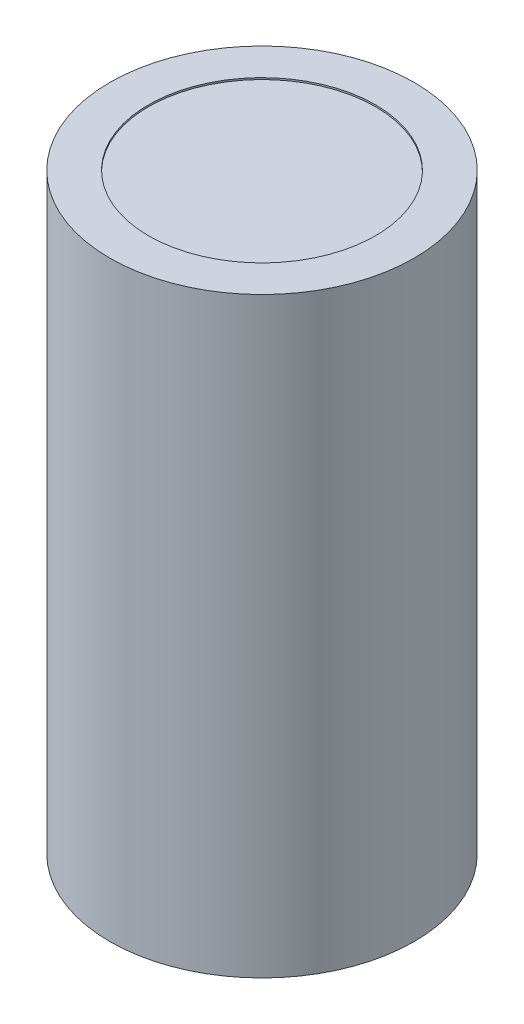
ISO-10303-21;
HEADER;
FILE_DESCRIPTION(('STEP AP214'),'2;1');
FILE_NAME('part.step','',(''),(''),'','','');
FILE_SCHEMA(('AUTOMOTIVE_DESIGN { 1 0 10303 214 1 1 1 1 }'));
ENDSEC;
DATA;
#1=APPLICATION_CONTEXT('core data for automotive mechanical design processes');
#2=APPLICATION_PROTOCOL_DEFINITION('international standard','automotive_design',2000,#1);
#3=PRODUCT_CONTEXT('',#1,'mechanical');
#4=PRODUCT('Part','Part','',(#3));
#5=PRODUCT_RELATED_PRODUCT_CATEGORY('part','',(#4));
#6=PRODUCT_DEFINITION_FORMATION('','',#4);
#7=PRODUCT_DEFINITION_CONTEXT('part definition',#1,'design');
#8=PRODUCT_DEFINITION('design','',#6,#7);
#9=PRODUCT_DEFINITION_SHAPE('','',#8);
#10=(LENGTH_UNIT() NAMED_UNIT(*) SI_UNIT(.MILLI.,.METRE.));
#11=(NAMED_UNIT(*) PLANE_ANGLE_UNIT() SI_UNIT($,.RADIAN.));
#12=(NAMED_UNIT(*) SI_UNIT($,.STERADIAN.) SOLID_ANGLE_UNIT());
#13=UNCERTAINTY_MEASURE_WITH_UNIT(LENGTH_MEASURE(1.E-05),#10,'distance_accuracy_value','');
#14=(GEOMETRIC_REPRESENTATION_CONTEXT(3) GLOBAL_UNCERTAINTY_ASSIGNED_CONTEXT((#13)) GLOBAL_UNIT_ASSIGNED_CONTEXT((#10,
#11,#12)) REPRESENTATION_CONTEXT('',''));
#15=CARTESIAN_POINT('',(0.,0.,0.));
#16=DIRECTION('',(0.,0.,1.));
#17=DIRECTION('',(1.,0.,0.));
#18=AXIS2_PLACEMENT_3D('',#15,#16,#17);
#19=CARTESIAN_POINT('',(0.,35.,0.));
#20=DIRECTION('',(0.,-1.,0.));
#21=DIRECTION('',(0.,0.,-1.));
#22=AXIS2_PLACEMENT_3D('',#19,#20,#21);
#23=CYLINDRICAL_SURFACE('',#22,9.);
#24=CARTESIAN_POINT('',(0.,35.,0.));
#25=DIRECTION('',(0.,1.,0.));
#26=DIRECTION('',(0.,0.,1.));
#27=AXIS2_PLACEMENT_3D('',#24,#25,#26);
#28=CIRCLE('',#27,9.);
#29=CARTESIAN_POINT('',(0.,35.,9.));
#30=VERTEX_POINT('',#29);
#31=EDGE_CURVE('E10',#30,#30,#28,.T.);
#32=ORIENTED_EDGE('',*,*,#31,.F.);
#33=EDGE_LOOP('',(#32));
#34=FACE_BOUND('',#33,.T.);
#35=CARTESIAN_POINT('',(0.,0.,0.));
#36=DIRECTION('',(0.,1.,0.));
#37=DIRECTION('',(0.,0.,1.));
#38=AXIS2_PLACEMENT_3D('',#35,#36,#37);
#39=CIRCLE('',#38,9.);
#40=CARTESIAN_POINT('',(0.,0.,9.));
#41=VERTEX_POINT('',#40);
#42=EDGE_CURVE('E36',#41,#41,#39,.T.);
#43=ORIENTED_EDGE('',*,*,#42,.T.);
#44=EDGE_LOOP('',(#43));
#45=FACE_BOUND('',#44,.T.);
#46=ADVANCED_FACE('F33',(#34,#45),#23,.T.);
#47=CARTESIAN_POINT('',(0.,35.,0.));
#48=DIRECTION('',(0.,1.,0.));
#49=DIRECTION('',(0.,0.,1.));
#50=AXIS2_PLACEMENT_3D('',#47,#48,#49);
#51=PLANE('',#50);
#52=CARTESIAN_POINT('',(0.,35.,0.));
#53=DIRECTION('',(0.,1.,0.));
#54=DIRECTION('',(0.,0.,1.));
#55=AXIS2_PLACEMENT_3D('',#52,#53,#54);
#56=CIRCLE('',#55,6.71139382845774);
#57=CARTESIAN_POINT('',(0.,35.,6.71139382845774));
#58=VERTEX_POINT('',#57);
#59=EDGE_CURVE('E45',#58,#58,#56,.T.);
#60=ORIENTED_EDGE('',*,*,#59,.F.);
#61=EDGE_LOOP('',(#60));
#62=FACE_BOUND('',#61,.T.);
#63=ORIENTED_EDGE('',*,*,#31,.T.);
#64=EDGE_LOOP('',(#63));
#65=FACE_BOUND('',#64,.T.);
#66=ADVANCED_FACE('F70',(#62,#65),#51,.T.);
#67=CARTESIAN_POINT('',(0.,0.,0.));
#68=DIRECTION('',(0.,1.,0.));
#69=DIRECTION('',(0.,0.,1.));
#70=AXIS2_PLACEMENT_3D('',#67,#68,#69);
#71=PLANE('',#70);
#72=CARTESIAN_POINT('',(0.,0.,0.));
#73=DIRECTION('',(0.,-1.,0.));
#74=DIRECTION('',(0.,0.,-1.));
#75=AXIS2_PLACEMENT_3D('',#72,#73,#74);
#76=CIRCLE('',#75,7.31835624621887);
#77=CARTESIAN_POINT('',(0.,0.,-7.31835624621887));
#78=VERTEX_POINT('',#77);
#79=EDGE_CURVE('E51',#78,#78,#76,.T.);
#80=ORIENTED_EDGE('',*,*,#79,.F.);
#81=EDGE_LOOP('',(#80));
#82=FACE_BOUND('',#81,.T.);
#83=ORIENTED_EDGE('',*,*,#42,.F.);
#84=EDGE_LOOP('',(#83));
#85=FACE_BOUND('',#84,.T.);
#86=ADVANCED_FACE('F66',(#82,#85),#71,.F.);
#87=CARTESIAN_POINT('',(0.,34.9,0.));
#88=DIRECTION('',(0.,1.,0.));
#89=DIRECTION('',(0.,0.,1.));
#90=AXIS2_PLACEMENT_3D('',#87,#88,#89);
#91=CYLINDRICAL_SURFACE('',#90,6.71139382845774);
#92=CARTESIAN_POINT('',(0.,34.9,0.));
#93=DIRECTION('',(0.,1.,0.));
#94=DIRECTION('',(0.,0.,1.));
#95=AXIS2_PLACEMENT_3D('',#92,#93,#94);
#96=CIRCLE('',#95,6.71139382845774);
#97=CARTESIAN_POINT('',(0.,34.9,6.71139382845774));
#98=VERTEX_POINT('',#97);
#99=EDGE_CURVE('E43',#98,#98,#96,.T.);
#100=ORIENTED_EDGE('',*,*,#99,.F.);
#101=EDGE_LOOP('',(#100));
#102=FACE_BOUND('',#101,.T.);
#103=ORIENTED_EDGE('',*,*,#59,.T.);
#104=EDGE_LOOP('',(#103));
#105=FACE_BOUND('',#104,.T.);
#106=ADVANCED_FACE('F69',(#102,#105),#91,.F.);
#107=CARTESIAN_POINT('',(0.,34.9,0.));
#108=DIRECTION('',(0.,1.,0.));
#109=DIRECTION('',(0.,0.,1.));
#110=AXIS2_PLACEMENT_3D('',#107,#108,#109);
#111=PLANE('',#110);
#112=ORIENTED_EDGE('',*,*,#99,.T.);
#113=EDGE_LOOP('',(#112));
#114=FACE_BOUND('',#113,.T.);
#115=ADVANCED_FACE('F62',(#114),#111,.T.);
#116=CARTESIAN_POINT('',(0.,0.1,0.));
#117=DIRECTION('',(0.,-1.,0.));
#118=DIRECTION('',(0.,0.,-1.));
#119=AXIS2_PLACEMENT_3D('',#116,#117,#118);
#120=CYLINDRICAL_SURFACE('',#119,7.31835624621887);
#121=CARTESIAN_POINT('',(0.,0.1,0.));
#122=DIRECTION('',(0.,-1.,0.));
#123=DIRECTION('',(0.,0.,-1.));
#124=AXIS2_PLACEMENT_3D('',#121,#122,#123);
#125=CIRCLE('',#124,7.31835624621887);
#126=CARTESIAN_POINT('',(0.,0.1,-7.31835624621887));
#127=VERTEX_POINT('',#126);
#128=EDGE_CURVE('E48',#127,#127,#125,.T.);
#129=ORIENTED_EDGE('',*,*,#128,.F.);
#130=EDGE_LOOP('',(#129));
#131=FACE_BOUND('',#130,.T.);
#132=ORIENTED_EDGE('',*,*,#79,.T.);
#133=EDGE_LOOP('',(#132));
#134=FACE_BOUND('',#133,.T.);
#135=ADVANCED_FACE('F59',(#131,#134),#120,.F.);
#136=CARTESIAN_POINT('',(0.,0.1,0.));
#137=DIRECTION('',(0.,-1.,0.));
#138=DIRECTION('',(0.,0.,-1.));
#139=AXIS2_PLACEMENT_3D('',#136,#137,#138);
#140=PLANE('',#139);
#141=ORIENTED_EDGE('',*,*,#128,.T.);
#142=EDGE_LOOP('',(#141));
#143=FACE_BOUND('',#142,.T.);
#144=ADVANCED_FACE('F57',(#143),#140,.T.);
#145=CLOSED_SHELL('',(#46,#66,#86,#106,#115,#135,#144));
#146=MANIFOLD_SOLID_BREP('B2',#145);
#147=ADVANCED_BREP_SHAPE_REPRESENTATION('',(#18,#146),#14);
#148=SHAPE_DEFINITION_REPRESENTATION(#9,#147);
ENDSEC;
END-ISO-10303-21;
